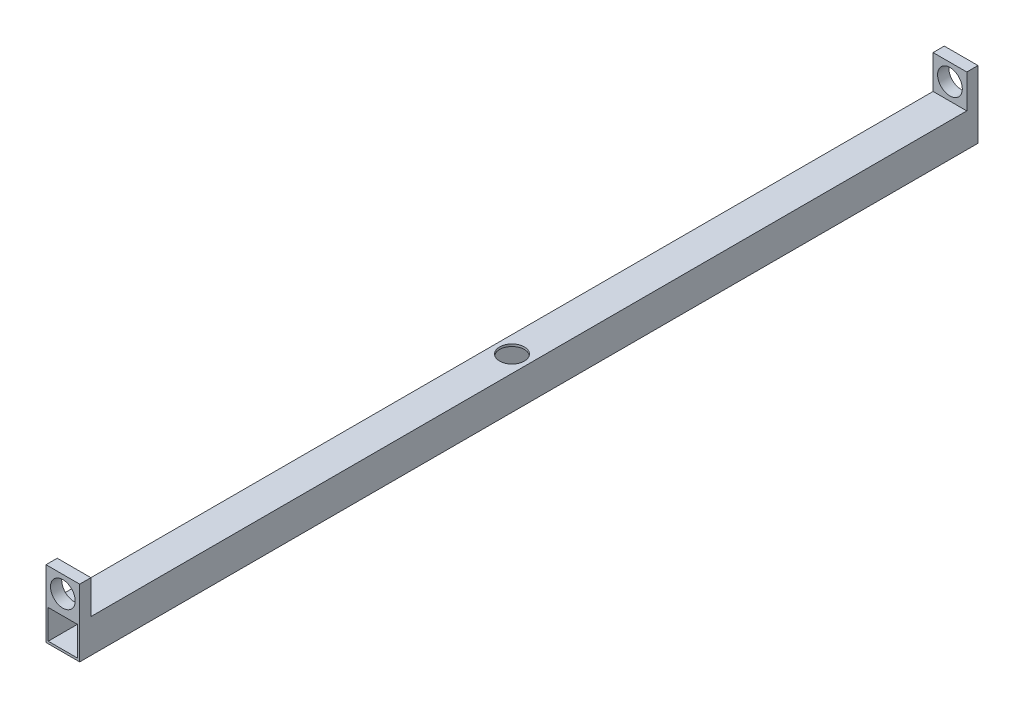
ISO-10303-21;
HEADER;
FILE_DESCRIPTION(('STEP AP214'),'2;1');
FILE_NAME('part.step','',(''),(''),'','','');
FILE_SCHEMA(('AUTOMOTIVE_DESIGN { 1 0 10303 214 1 1 1 1 }'));
ENDSEC;
DATA;
#1=APPLICATION_CONTEXT('core data for automotive mechanical design processes');
#2=APPLICATION_PROTOCOL_DEFINITION('international standard','automotive_design',2000,#1);
#3=PRODUCT_CONTEXT('',#1,'mechanical');
#4=PRODUCT('Part','Part','',(#3));
#5=PRODUCT_RELATED_PRODUCT_CATEGORY('part','',(#4));
#6=PRODUCT_DEFINITION_FORMATION('','',#4);
#7=PRODUCT_DEFINITION_CONTEXT('part definition',#1,'design');
#8=PRODUCT_DEFINITION('design','',#6,#7);
#9=PRODUCT_DEFINITION_SHAPE('','',#8);
#10=(LENGTH_UNIT() NAMED_UNIT(*) SI_UNIT(.MILLI.,.METRE.));
#11=(NAMED_UNIT(*) PLANE_ANGLE_UNIT() SI_UNIT($,.RADIAN.));
#12=(NAMED_UNIT(*) SI_UNIT($,.STERADIAN.) SOLID_ANGLE_UNIT());
#13=UNCERTAINTY_MEASURE_WITH_UNIT(LENGTH_MEASURE(1.E-05),#10,'distance_accuracy_value','');
#14=(GEOMETRIC_REPRESENTATION_CONTEXT(3) GLOBAL_UNCERTAINTY_ASSIGNED_CONTEXT((#13)) GLOBAL_UNIT_ASSIGNED_CONTEXT((#10,
#11,#12)) REPRESENTATION_CONTEXT('',''));
#15=CARTESIAN_POINT('',(0.,0.,0.));
#16=DIRECTION('',(0.,0.,1.));
#17=DIRECTION('',(1.,0.,0.));
#18=AXIS2_PLACEMENT_3D('',#15,#16,#17);
#19=CARTESIAN_POINT('',(0.,0.,800.));
#20=DIRECTION('',(0.,0.,-1.));
#21=DIRECTION('',(-1.,0.,0.));
#22=AXIS2_PLACEMENT_3D('',#19,#20,#21);
#23=PLANE('',#22);
#24=DIRECTION('',(0.,-1.,0.));
#25=VECTOR('',#24,1.);
#26=CARTESIAN_POINT('',(-15.,15.,800.));
#27=LINE('',#26,#25);
#28=CARTESIAN_POINT('',(-15.,45.,800.));
#29=VERTEX_POINT('',#28);
#30=CARTESIAN_POINT('',(-15.,-15.,800.));
#31=VERTEX_POINT('',#30);
#32=EDGE_CURVE('E183',#29,#31,#27,.T.);
#33=ORIENTED_EDGE('',*,*,#32,.T.);
#34=DIRECTION('',(1.,0.,0.));
#35=VECTOR('',#34,1.);
#36=CARTESIAN_POINT('',(15.,-15.,800.));
#37=LINE('',#36,#35);
#38=CARTESIAN_POINT('',(15.,-15.,800.));
#39=VERTEX_POINT('',#38);
#40=EDGE_CURVE('E159',#31,#39,#37,.T.);
#41=ORIENTED_EDGE('',*,*,#40,.T.);
#42=DIRECTION('',(0.,1.,0.));
#43=VECTOR('',#42,1.);
#44=CARTESIAN_POINT('',(15.,15.,800.));
#45=LINE('',#44,#43);
#46=CARTESIAN_POINT('',(15.,45.,800.));
#47=VERTEX_POINT('',#46);
#48=EDGE_CURVE('E154',#39,#47,#45,.T.);
#49=ORIENTED_EDGE('',*,*,#48,.T.);
#50=DIRECTION('',(-1.,0.,0.));
#51=VECTOR('',#50,1.);
#52=CARTESIAN_POINT('',(-15.,45.,800.));
#53=LINE('',#52,#51);
#54=EDGE_CURVE('E146',#47,#29,#53,.T.);
#55=ORIENTED_EDGE('',*,*,#54,.T.);
#56=EDGE_LOOP('',(#33,#41,#49,#55));
#57=FACE_BOUND('',#56,.T.);
#58=DIRECTION('',(0.,-1.,0.));
#59=VECTOR('',#58,1.);
#60=CARTESIAN_POINT('',(-13.,13.,800.));
#61=LINE('',#60,#59);
#62=CARTESIAN_POINT('',(-13.,13.,800.));
#63=VERTEX_POINT('',#62);
#64=CARTESIAN_POINT('',(-13.,-13.,800.));
#65=VERTEX_POINT('',#64);
#66=EDGE_CURVE('E212',#63,#65,#61,.T.);
#67=ORIENTED_EDGE('',*,*,#66,.F.);
#68=DIRECTION('',(-1.,0.,0.));
#69=VECTOR('',#68,1.);
#70=CARTESIAN_POINT('',(13.,13.,800.));
#71=LINE('',#70,#69);
#72=CARTESIAN_POINT('',(13.,13.,800.));
#73=VERTEX_POINT('',#72);
#74=EDGE_CURVE('E207',#73,#63,#71,.T.);
#75=ORIENTED_EDGE('',*,*,#74,.F.);
#76=DIRECTION('',(0.,1.,0.));
#77=VECTOR('',#76,1.);
#78=CARTESIAN_POINT('',(13.,13.,800.));
#79=LINE('',#78,#77);
#80=CARTESIAN_POINT('',(13.,-13.,800.));
#81=VERTEX_POINT('',#80);
#82=EDGE_CURVE('E228',#81,#73,#79,.T.);
#83=ORIENTED_EDGE('',*,*,#82,.F.);
#84=DIRECTION('',(1.,0.,0.));
#85=VECTOR('',#84,1.);
#86=CARTESIAN_POINT('',(13.,-13.,800.));
#87=LINE('',#86,#85);
#88=EDGE_CURVE('E231',#65,#81,#87,.T.);
#89=ORIENTED_EDGE('',*,*,#88,.F.);
#90=EDGE_LOOP('',(#67,#75,#83,#89));
#91=FACE_BOUND('',#90,.T.);
#92=CARTESIAN_POINT('',(0.,30.,800.));
#93=DIRECTION('',(0.,0.,1.));
#94=DIRECTION('',(1.,0.,0.));
#95=AXIS2_PLACEMENT_3D('',#92,#93,#94);
#96=CIRCLE('',#95,11.);
#97=CARTESIAN_POINT('',(11.,30.,800.));
#98=VERTEX_POINT('',#97);
#99=EDGE_CURVE('E279',#98,#98,#96,.T.);
#100=ORIENTED_EDGE('',*,*,#99,.F.);
#101=EDGE_LOOP('',(#100));
#102=FACE_BOUND('',#101,.T.);
#103=ADVANCED_FACE('F38',(#57,#91,#102),#23,.F.);
#104=CARTESIAN_POINT('',(0.,0.,0.));
#105=DIRECTION('',(0.,0.,-1.));
#106=DIRECTION('',(-1.,0.,0.));
#107=AXIS2_PLACEMENT_3D('',#104,#105,#106);
#108=PLANE('',#107);
#109=DIRECTION('',(0.,-1.,0.));
#110=VECTOR('',#109,1.);
#111=CARTESIAN_POINT('',(-15.,15.,0.));
#112=LINE('',#111,#110);
#113=CARTESIAN_POINT('',(-15.,45.,0.));
#114=VERTEX_POINT('',#113);
#115=CARTESIAN_POINT('',(-15.,-15.,0.));
#116=VERTEX_POINT('',#115);
#117=EDGE_CURVE('E188',#114,#116,#112,.T.);
#118=ORIENTED_EDGE('',*,*,#117,.F.);
#119=DIRECTION('',(1.,0.,0.));
#120=VECTOR('',#119,1.);
#121=CARTESIAN_POINT('',(15.,45.,0.));
#122=LINE('',#121,#120);
#123=CARTESIAN_POINT('',(15.,45.,0.));
#124=VERTEX_POINT('',#123);
#125=EDGE_CURVE('E181',#114,#124,#122,.T.);
#126=ORIENTED_EDGE('',*,*,#125,.T.);
#127=DIRECTION('',(0.,1.,0.));
#128=VECTOR('',#127,1.);
#129=CARTESIAN_POINT('',(15.,15.,0.));
#130=LINE('',#129,#128);
#131=CARTESIAN_POINT('',(15.,-15.,0.));
#132=VERTEX_POINT('',#131);
#133=EDGE_CURVE('E162',#132,#124,#130,.T.);
#134=ORIENTED_EDGE('',*,*,#133,.F.);
#135=DIRECTION('',(1.,0.,0.));
#136=VECTOR('',#135,1.);
#137=CARTESIAN_POINT('',(15.,-15.,0.));
#138=LINE('',#137,#136);
#139=EDGE_CURVE('E179',#116,#132,#138,.T.);
#140=ORIENTED_EDGE('',*,*,#139,.F.);
#141=EDGE_LOOP('',(#118,#126,#134,#140));
#142=FACE_BOUND('',#141,.T.);
#143=DIRECTION('',(-1.,0.,0.));
#144=VECTOR('',#143,1.);
#145=CARTESIAN_POINT('',(13.,13.,0.));
#146=LINE('',#145,#144);
#147=CARTESIAN_POINT('',(13.,13.,0.));
#148=VERTEX_POINT('',#147);
#149=CARTESIAN_POINT('',(-13.,13.,0.));
#150=VERTEX_POINT('',#149);
#151=EDGE_CURVE('E208',#148,#150,#146,.T.);
#152=ORIENTED_EDGE('',*,*,#151,.T.);
#153=DIRECTION('',(0.,-1.,0.));
#154=VECTOR('',#153,1.);
#155=CARTESIAN_POINT('',(-13.,13.,0.));
#156=LINE('',#155,#154);
#157=CARTESIAN_POINT('',(-13.,-13.,0.));
#158=VERTEX_POINT('',#157);
#159=EDGE_CURVE('E221',#150,#158,#156,.T.);
#160=ORIENTED_EDGE('',*,*,#159,.T.);
#161=DIRECTION('',(1.,0.,0.));
#162=VECTOR('',#161,1.);
#163=CARTESIAN_POINT('',(13.,-13.,0.));
#164=LINE('',#163,#162);
#165=CARTESIAN_POINT('',(13.,-13.,0.));
#166=VERTEX_POINT('',#165);
#167=EDGE_CURVE('E217',#158,#166,#164,.T.);
#168=ORIENTED_EDGE('',*,*,#167,.T.);
#169=DIRECTION('',(0.,1.,0.));
#170=VECTOR('',#169,1.);
#171=CARTESIAN_POINT('',(13.,13.,0.));
#172=LINE('',#171,#170);
#173=EDGE_CURVE('E213',#166,#148,#172,.T.);
#174=ORIENTED_EDGE('',*,*,#173,.T.);
#175=EDGE_LOOP('',(#152,#160,#168,#174));
#176=FACE_BOUND('',#175,.T.);
#177=CARTESIAN_POINT('',(0.,30.,0.));
#178=DIRECTION('',(0.,0.,-1.));
#179=DIRECTION('',(-1.,0.,0.));
#180=AXIS2_PLACEMENT_3D('',#177,#178,#179);
#181=CIRCLE('',#180,11.);
#182=CARTESIAN_POINT('',(-11.,30.,0.));
#183=VERTEX_POINT('',#182);
#184=EDGE_CURVE('E258',#183,#183,#181,.T.);
#185=ORIENTED_EDGE('',*,*,#184,.F.);
#186=EDGE_LOOP('',(#185));
#187=FACE_BOUND('',#186,.T.);
#188=ADVANCED_FACE('F177',(#142,#176,#187),#108,.T.);
#189=CARTESIAN_POINT('',(-15.,15.,800.));
#190=DIRECTION('',(1.,0.,0.));
#191=DIRECTION('',(0.,0.,-1.));
#192=AXIS2_PLACEMENT_3D('',#189,#190,#191);
#193=PLANE('',#192);
#194=ORIENTED_EDGE('',*,*,#117,.T.);
#195=DIRECTION('',(0.,0.,-1.));
#196=VECTOR('',#195,1.);
#197=CARTESIAN_POINT('',(-15.,-15.,800.));
#198=LINE('',#197,#196);
#199=EDGE_CURVE('E11',#31,#116,#198,.T.);
#200=ORIENTED_EDGE('',*,*,#199,.F.);
#201=ORIENTED_EDGE('',*,*,#32,.F.);
#202=DIRECTION('',(0.,0.,1.));
#203=VECTOR('',#202,1.);
#204=CARTESIAN_POINT('',(-15.,45.,790.));
#205=LINE('',#204,#203);
#206=CARTESIAN_POINT('',(-15.,45.,790.));
#207=VERTEX_POINT('',#206);
#208=EDGE_CURVE('E144',#207,#29,#205,.T.);
#209=ORIENTED_EDGE('',*,*,#208,.F.);
#210=DIRECTION('',(0.,-1.,0.));
#211=VECTOR('',#210,1.);
#212=CARTESIAN_POINT('',(-15.,15.,790.));
#213=LINE('',#212,#211);
#214=CARTESIAN_POINT('',(-15.,15.,790.));
#215=VERTEX_POINT('',#214);
#216=EDGE_CURVE('E134',#207,#215,#213,.T.);
#217=ORIENTED_EDGE('',*,*,#216,.T.);
#218=DIRECTION('',(0.,0.,-1.));
#219=VECTOR('',#218,1.);
#220=CARTESIAN_POINT('',(-15.,15.,800.));
#221=LINE('',#220,#219);
#222=CARTESIAN_POINT('',(-15.,15.,10.));
#223=VERTEX_POINT('',#222);
#224=EDGE_CURVE('E55',#215,#223,#221,.T.);
#225=ORIENTED_EDGE('',*,*,#224,.T.);
#226=DIRECTION('',(0.,1.,0.));
#227=VECTOR('',#226,1.);
#228=CARTESIAN_POINT('',(-15.,15.,10.));
#229=LINE('',#228,#227);
#230=CARTESIAN_POINT('',(-15.,45.,10.));
#231=VERTEX_POINT('',#230);
#232=EDGE_CURVE('E250',#223,#231,#229,.T.);
#233=ORIENTED_EDGE('',*,*,#232,.T.);
#234=DIRECTION('',(0.,0.,-1.));
#235=VECTOR('',#234,1.);
#236=CARTESIAN_POINT('',(-15.,45.,10.));
#237=LINE('',#236,#235);
#238=EDGE_CURVE('E236',#231,#114,#237,.T.);
#239=ORIENTED_EDGE('',*,*,#238,.T.);
#240=EDGE_LOOP('',(#194,#200,#201,#209,#217,#225,#233,#239));
#241=FACE_BOUND('',#240,.T.);
#242=ADVANCED_FACE('F40',(#241),#193,.F.);
#243=CARTESIAN_POINT('',(15.,-15.,800.));
#244=DIRECTION('',(0.,1.,0.));
#245=DIRECTION('',(0.,0.,1.));
#246=AXIS2_PLACEMENT_3D('',#243,#244,#245);
#247=PLANE('',#246);
#248=CARTESIAN_POINT('',(0.,-15.,400.));
#249=DIRECTION('',(0.,-1.,0.));
#250=DIRECTION('',(0.,0.,-1.));
#251=AXIS2_PLACEMENT_3D('',#248,#249,#250);
#252=CIRCLE('',#251,11.);
#253=CARTESIAN_POINT('',(0.,-15.,389.));
#254=VERTEX_POINT('',#253);
#255=EDGE_CURVE('E294',#254,#254,#252,.T.);
#256=ORIENTED_EDGE('',*,*,#255,.F.);
#257=EDGE_LOOP('',(#256));
#258=FACE_BOUND('',#257,.T.);
#259=ORIENTED_EDGE('',*,*,#139,.T.);
#260=DIRECTION('',(0.,0.,-1.));
#261=VECTOR('',#260,1.);
#262=CARTESIAN_POINT('',(15.,-15.,800.));
#263=LINE('',#262,#261);
#264=EDGE_CURVE('E48',#39,#132,#263,.T.);
#265=ORIENTED_EDGE('',*,*,#264,.F.);
#266=ORIENTED_EDGE('',*,*,#40,.F.);
#267=ORIENTED_EDGE('',*,*,#199,.T.);
#268=EDGE_LOOP('',(#259,#265,#266,#267));
#269=FACE_BOUND('',#268,.T.);
#270=ADVANCED_FACE('F349',(#258,#269),#247,.F.);
#271=CARTESIAN_POINT('',(15.,15.,800.));
#272=DIRECTION('',(-1.,0.,0.));
#273=DIRECTION('',(0.,0.,1.));
#274=AXIS2_PLACEMENT_3D('',#271,#272,#273);
#275=PLANE('',#274);
#276=ORIENTED_EDGE('',*,*,#133,.T.);
#277=DIRECTION('',(0.,0.,-1.));
#278=VECTOR('',#277,1.);
#279=CARTESIAN_POINT('',(15.,45.,10.));
#280=LINE('',#279,#278);
#281=CARTESIAN_POINT('',(15.,45.,10.));
#282=VERTEX_POINT('',#281);
#283=EDGE_CURVE('E225',#282,#124,#280,.T.);
#284=ORIENTED_EDGE('',*,*,#283,.F.);
#285=DIRECTION('',(0.,-1.,0.));
#286=VECTOR('',#285,1.);
#287=CARTESIAN_POINT('',(15.,15.,10.));
#288=LINE('',#287,#286);
#289=CARTESIAN_POINT('',(15.,15.,10.));
#290=VERTEX_POINT('',#289);
#291=EDGE_CURVE('E245',#282,#290,#288,.T.);
#292=ORIENTED_EDGE('',*,*,#291,.T.);
#293=DIRECTION('',(0.,0.,-1.));
#294=VECTOR('',#293,1.);
#295=CARTESIAN_POINT('',(15.,15.,800.));
#296=LINE('',#295,#294);
#297=CARTESIAN_POINT('',(15.,15.,790.));
#298=VERTEX_POINT('',#297);
#299=EDGE_CURVE('E153',#298,#290,#296,.T.);
#300=ORIENTED_EDGE('',*,*,#299,.F.);
#301=DIRECTION('',(0.,1.,0.));
#302=VECTOR('',#301,1.);
#303=CARTESIAN_POINT('',(15.,15.,790.));
#304=LINE('',#303,#302);
#305=CARTESIAN_POINT('',(15.,45.,790.));
#306=VERTEX_POINT('',#305);
#307=EDGE_CURVE('E137',#298,#306,#304,.T.);
#308=ORIENTED_EDGE('',*,*,#307,.T.);
#309=DIRECTION('',(0.,0.,1.));
#310=VECTOR('',#309,1.);
#311=CARTESIAN_POINT('',(15.,45.,790.));
#312=LINE('',#311,#310);
#313=EDGE_CURVE('E265',#306,#47,#312,.T.);
#314=ORIENTED_EDGE('',*,*,#313,.T.);
#315=ORIENTED_EDGE('',*,*,#48,.F.);
#316=ORIENTED_EDGE('',*,*,#264,.T.);
#317=EDGE_LOOP('',(#276,#284,#292,#300,#308,#314,#315,#316));
#318=FACE_BOUND('',#317,.T.);
#319=ADVANCED_FACE('F171',(#318),#275,.F.);
#320=CARTESIAN_POINT('',(15.,15.,800.));
#321=DIRECTION('',(0.,-1.,0.));
#322=DIRECTION('',(0.,0.,-1.));
#323=AXIS2_PLACEMENT_3D('',#320,#321,#322);
#324=PLANE('',#323);
#325=CARTESIAN_POINT('',(0.,15.,400.));
#326=DIRECTION('',(0.,-1.,0.));
#327=DIRECTION('',(0.,0.,-1.));
#328=AXIS2_PLACEMENT_3D('',#325,#326,#327);
#329=CIRCLE('',#328,11.);
#330=CARTESIAN_POINT('',(0.,15.,389.));
#331=VERTEX_POINT('',#330);
#332=EDGE_CURVE('E283',#331,#331,#329,.T.);
#333=ORIENTED_EDGE('',*,*,#332,.T.);
#334=EDGE_LOOP('',(#333));
#335=FACE_BOUND('',#334,.T.);
#336=ORIENTED_EDGE('',*,*,#224,.F.);
#337=DIRECTION('',(1.,0.,0.));
#338=VECTOR('',#337,1.);
#339=CARTESIAN_POINT('',(-15.,15.,790.));
#340=LINE('',#339,#338);
#341=EDGE_CURVE('E131',#215,#298,#340,.T.);
#342=ORIENTED_EDGE('',*,*,#341,.T.);
#343=ORIENTED_EDGE('',*,*,#299,.T.);
#344=DIRECTION('',(-1.,0.,0.));
#345=VECTOR('',#344,1.);
#346=CARTESIAN_POINT('',(15.,15.,10.));
#347=LINE('',#346,#345);
#348=EDGE_CURVE('E151',#290,#223,#347,.T.);
#349=ORIENTED_EDGE('',*,*,#348,.T.);
#350=EDGE_LOOP('',(#336,#342,#343,#349));
#351=FACE_BOUND('',#350,.T.);
#352=ADVANCED_FACE('F149',(#335,#351),#324,.F.);
#353=CARTESIAN_POINT('',(-13.,13.,800.));
#354=DIRECTION('',(1.,0.,0.));
#355=DIRECTION('',(0.,0.,-1.));
#356=AXIS2_PLACEMENT_3D('',#353,#354,#355);
#357=PLANE('',#356);
#358=ORIENTED_EDGE('',*,*,#159,.F.);
#359=DIRECTION('',(0.,0.,-1.));
#360=VECTOR('',#359,1.);
#361=CARTESIAN_POINT('',(-13.,13.,800.));
#362=LINE('',#361,#360);
#363=EDGE_CURVE('E203',#63,#150,#362,.T.);
#364=ORIENTED_EDGE('',*,*,#363,.F.);
#365=ORIENTED_EDGE('',*,*,#66,.T.);
#366=DIRECTION('',(0.,0.,-1.));
#367=VECTOR('',#366,1.);
#368=CARTESIAN_POINT('',(-13.,-13.,800.));
#369=LINE('',#368,#367);
#370=EDGE_CURVE('E190',#65,#158,#369,.T.);
#371=ORIENTED_EDGE('',*,*,#370,.T.);
#372=EDGE_LOOP('',(#358,#364,#365,#371));
#373=FACE_BOUND('',#372,.T.);
#374=ADVANCED_FACE('F323',(#373),#357,.T.);
#375=CARTESIAN_POINT('',(13.,-13.,800.));
#376=DIRECTION('',(0.,1.,0.));
#377=DIRECTION('',(0.,0.,1.));
#378=AXIS2_PLACEMENT_3D('',#375,#376,#377);
#379=PLANE('',#378);
#380=CARTESIAN_POINT('',(0.,-13.,400.));
#381=DIRECTION('',(0.,1.,0.));
#382=DIRECTION('',(0.,0.,1.));
#383=AXIS2_PLACEMENT_3D('',#380,#381,#382);
#384=CIRCLE('',#383,11.);
#385=CARTESIAN_POINT('',(0.,-13.,411.));
#386=VERTEX_POINT('',#385);
#387=EDGE_CURVE('E290',#386,#386,#384,.T.);
#388=ORIENTED_EDGE('',*,*,#387,.F.);
#389=EDGE_LOOP('',(#388));
#390=FACE_BOUND('',#389,.T.);
#391=ORIENTED_EDGE('',*,*,#167,.F.);
#392=ORIENTED_EDGE('',*,*,#370,.F.);
#393=ORIENTED_EDGE('',*,*,#88,.T.);
#394=DIRECTION('',(0.,0.,-1.));
#395=VECTOR('',#394,1.);
#396=CARTESIAN_POINT('',(13.,-13.,800.));
#397=LINE('',#396,#395);
#398=EDGE_CURVE('E198',#81,#166,#397,.T.);
#399=ORIENTED_EDGE('',*,*,#398,.T.);
#400=EDGE_LOOP('',(#391,#392,#393,#399));
#401=FACE_BOUND('',#400,.T.);
#402=ADVANCED_FACE('F326',(#390,#401),#379,.T.);
#403=CARTESIAN_POINT('',(13.,13.,800.));
#404=DIRECTION('',(-1.,0.,0.));
#405=DIRECTION('',(0.,0.,1.));
#406=AXIS2_PLACEMENT_3D('',#403,#404,#405);
#407=PLANE('',#406);
#408=ORIENTED_EDGE('',*,*,#173,.F.);
#409=ORIENTED_EDGE('',*,*,#398,.F.);
#410=ORIENTED_EDGE('',*,*,#82,.T.);
#411=DIRECTION('',(0.,0.,-1.));
#412=VECTOR('',#411,1.);
#413=CARTESIAN_POINT('',(13.,13.,800.));
#414=LINE('',#413,#412);
#415=EDGE_CURVE('E63',#73,#148,#414,.T.);
#416=ORIENTED_EDGE('',*,*,#415,.T.);
#417=EDGE_LOOP('',(#408,#409,#410,#416));
#418=FACE_BOUND('',#417,.T.);
#419=ADVANCED_FACE('F309',(#418),#407,.T.);
#420=CARTESIAN_POINT('',(13.,13.,800.));
#421=DIRECTION('',(0.,-1.,0.));
#422=DIRECTION('',(0.,0.,-1.));
#423=AXIS2_PLACEMENT_3D('',#420,#421,#422);
#424=PLANE('',#423);
#425=CARTESIAN_POINT('',(0.,13.,400.));
#426=DIRECTION('',(0.,-1.,0.));
#427=DIRECTION('',(0.,0.,-1.));
#428=AXIS2_PLACEMENT_3D('',#425,#426,#427);
#429=CIRCLE('',#428,11.);
#430=CARTESIAN_POINT('',(0.,13.,389.));
#431=VERTEX_POINT('',#430);
#432=EDGE_CURVE('E42',#431,#431,#429,.T.);
#433=ORIENTED_EDGE('',*,*,#432,.F.);
#434=EDGE_LOOP('',(#433));
#435=FACE_BOUND('',#434,.T.);
#436=ORIENTED_EDGE('',*,*,#151,.F.);
#437=ORIENTED_EDGE('',*,*,#415,.F.);
#438=ORIENTED_EDGE('',*,*,#74,.T.);
#439=ORIENTED_EDGE('',*,*,#363,.T.);
#440=EDGE_LOOP('',(#436,#437,#438,#439));
#441=FACE_BOUND('',#440,.T.);
#442=ADVANCED_FACE('F306',(#435,#441),#424,.T.);
#443=CARTESIAN_POINT('',(15.,45.,10.));
#444=DIRECTION('',(0.,1.,0.));
#445=DIRECTION('',(0.,0.,1.));
#446=AXIS2_PLACEMENT_3D('',#443,#444,#445);
#447=PLANE('',#446);
#448=ORIENTED_EDGE('',*,*,#125,.F.);
#449=ORIENTED_EDGE('',*,*,#238,.F.);
#450=DIRECTION('',(1.,0.,0.));
#451=VECTOR('',#450,1.);
#452=CARTESIAN_POINT('',(15.,45.,10.));
#453=LINE('',#452,#451);
#454=EDGE_CURVE('E240',#231,#282,#453,.T.);
#455=ORIENTED_EDGE('',*,*,#454,.T.);
#456=ORIENTED_EDGE('',*,*,#283,.T.);
#457=EDGE_LOOP('',(#448,#449,#455,#456));
#458=FACE_BOUND('',#457,.T.);
#459=ADVANCED_FACE('F308',(#458),#447,.T.);
#460=CARTESIAN_POINT('',(0.,0.,10.));
#461=DIRECTION('',(0.,0.,1.));
#462=DIRECTION('',(1.,0.,0.));
#463=AXIS2_PLACEMENT_3D('',#460,#461,#462);
#464=PLANE('',#463);
#465=CARTESIAN_POINT('',(0.,30.,10.));
#466=DIRECTION('',(0.,0.,-1.));
#467=DIRECTION('',(-1.,0.,0.));
#468=AXIS2_PLACEMENT_3D('',#465,#466,#467);
#469=CIRCLE('',#468,11.);
#470=CARTESIAN_POINT('',(-11.,30.,10.));
#471=VERTEX_POINT('',#470);
#472=EDGE_CURVE('E246',#471,#471,#469,.T.);
#473=ORIENTED_EDGE('',*,*,#472,.T.);
#474=EDGE_LOOP('',(#473));
#475=FACE_BOUND('',#474,.T.);
#476=ORIENTED_EDGE('',*,*,#291,.F.);
#477=ORIENTED_EDGE('',*,*,#454,.F.);
#478=ORIENTED_EDGE('',*,*,#232,.F.);
#479=ORIENTED_EDGE('',*,*,#348,.F.);
#480=EDGE_LOOP('',(#476,#477,#478,#479));
#481=FACE_BOUND('',#480,.T.);
#482=ADVANCED_FACE('F378',(#475,#481),#464,.T.);
#483=CARTESIAN_POINT('',(0.,30.,10.));
#484=DIRECTION('',(0.,0.,-1.));
#485=DIRECTION('',(-1.,0.,0.));
#486=AXIS2_PLACEMENT_3D('',#483,#484,#485);
#487=CYLINDRICAL_SURFACE('',#486,11.);
#488=ORIENTED_EDGE('',*,*,#472,.F.);
#489=EDGE_LOOP('',(#488));
#490=FACE_BOUND('',#489,.T.);
#491=ORIENTED_EDGE('',*,*,#184,.T.);
#492=EDGE_LOOP('',(#491));
#493=FACE_BOUND('',#492,.T.);
#494=ADVANCED_FACE('F389',(#490,#493),#487,.F.);
#495=CARTESIAN_POINT('',(-15.,45.,790.));
#496=DIRECTION('',(0.,1.,0.));
#497=DIRECTION('',(0.,0.,1.));
#498=AXIS2_PLACEMENT_3D('',#495,#496,#497);
#499=PLANE('',#498);
#500=ORIENTED_EDGE('',*,*,#54,.F.);
#501=ORIENTED_EDGE('',*,*,#313,.F.);
#502=DIRECTION('',(-1.,0.,0.));
#503=VECTOR('',#502,1.);
#504=CARTESIAN_POINT('',(-15.,45.,790.));
#505=LINE('',#504,#503);
#506=EDGE_CURVE('E268',#306,#207,#505,.T.);
#507=ORIENTED_EDGE('',*,*,#506,.T.);
#508=ORIENTED_EDGE('',*,*,#208,.T.);
#509=EDGE_LOOP('',(#500,#501,#507,#508));
#510=FACE_BOUND('',#509,.T.);
#511=ADVANCED_FACE('F398',(#510),#499,.T.);
#512=CARTESIAN_POINT('',(0.,0.,790.));
#513=DIRECTION('',(0.,0.,-1.));
#514=DIRECTION('',(-1.,0.,0.));
#515=AXIS2_PLACEMENT_3D('',#512,#513,#514);
#516=PLANE('',#515);
#517=CARTESIAN_POINT('',(0.,30.,790.));
#518=DIRECTION('',(0.,0.,1.));
#519=DIRECTION('',(1.,0.,0.));
#520=AXIS2_PLACEMENT_3D('',#517,#518,#519);
#521=CIRCLE('',#520,11.);
#522=CARTESIAN_POINT('',(11.,30.,790.));
#523=VERTEX_POINT('',#522);
#524=EDGE_CURVE('E274',#523,#523,#521,.T.);
#525=ORIENTED_EDGE('',*,*,#524,.T.);
#526=EDGE_LOOP('',(#525));
#527=FACE_BOUND('',#526,.T.);
#528=ORIENTED_EDGE('',*,*,#216,.F.);
#529=ORIENTED_EDGE('',*,*,#506,.F.);
#530=ORIENTED_EDGE('',*,*,#307,.F.);
#531=ORIENTED_EDGE('',*,*,#341,.F.);
#532=EDGE_LOOP('',(#528,#529,#530,#531));
#533=FACE_BOUND('',#532,.T.);
#534=ADVANCED_FACE('F132',(#527,#533),#516,.T.);
#535=CARTESIAN_POINT('',(0.,30.,790.));
#536=DIRECTION('',(0.,0.,1.));
#537=DIRECTION('',(1.,0.,0.));
#538=AXIS2_PLACEMENT_3D('',#535,#536,#537);
#539=CYLINDRICAL_SURFACE('',#538,11.);
#540=ORIENTED_EDGE('',*,*,#524,.F.);
#541=EDGE_LOOP('',(#540));
#542=FACE_BOUND('',#541,.T.);
#543=ORIENTED_EDGE('',*,*,#99,.T.);
#544=EDGE_LOOP('',(#543));
#545=FACE_BOUND('',#544,.T.);
#546=ADVANCED_FACE('F437',(#542,#545),#539,.F.);
#547=CARTESIAN_POINT('',(0.,35.,400.));
#548=DIRECTION('',(0.,-1.,0.));
#549=DIRECTION('',(0.,0.,-1.));
#550=AXIS2_PLACEMENT_3D('',#547,#548,#549);
#551=CYLINDRICAL_SURFACE('',#550,11.);
#552=ORIENTED_EDGE('',*,*,#432,.T.);
#553=EDGE_LOOP('',(#552));
#554=FACE_BOUND('',#553,.T.);
#555=ORIENTED_EDGE('',*,*,#332,.F.);
#556=EDGE_LOOP('',(#555));
#557=FACE_BOUND('',#556,.T.);
#558=ADVANCED_FACE('F303',(#554,#557),#551,.F.);
#559=ORIENTED_EDGE('',*,*,#387,.T.);
#560=EDGE_LOOP('',(#559));
#561=FACE_BOUND('',#560,.T.);
#562=ORIENTED_EDGE('',*,*,#255,.T.);
#563=EDGE_LOOP('',(#562));
#564=FACE_BOUND('',#563,.T.);
#565=ADVANCED_FACE('F454',(#561,#564),#551,.F.);
#566=CLOSED_SHELL('',(#103,#188,#242,#270,#319,#352,#374,#402,#419,#442,#459,#482,#494,#511,
#534,#546,#558,#565));
#567=MANIFOLD_SOLID_BREP('B2',#566);
#568=ADVANCED_BREP_SHAPE_REPRESENTATION('',(#18,#567),#14);
#569=SHAPE_DEFINITION_REPRESENTATION(#9,#568);
ENDSEC;
END-ISO-10303-21;
